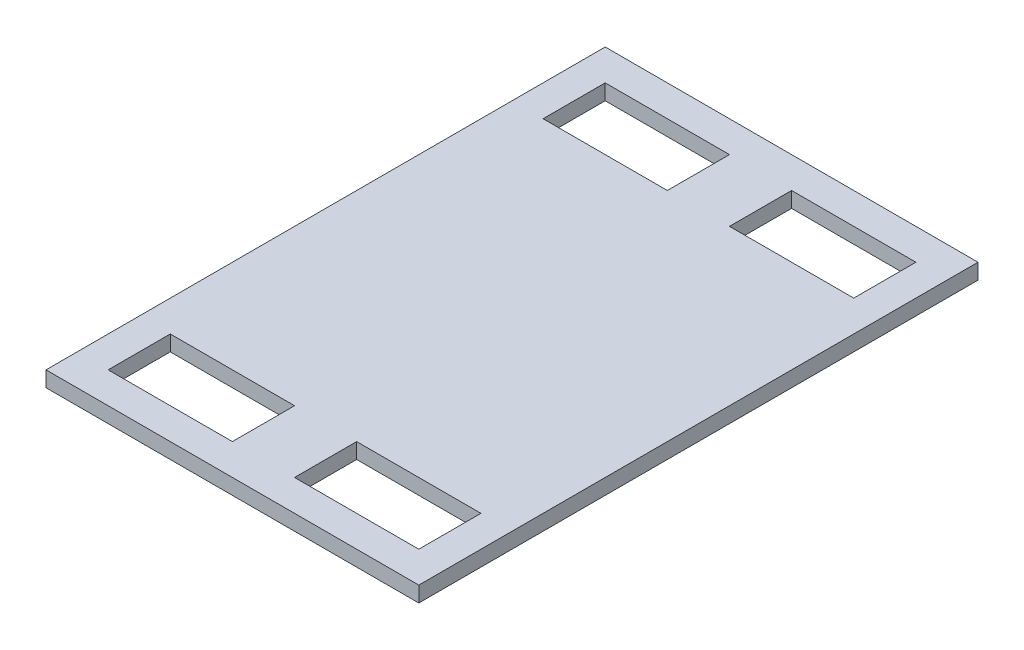
ISO-10303-21;
HEADER;
FILE_DESCRIPTION(('STEP AP214'),'2;1');
FILE_NAME('part.step','',(''),(''),'','','');
FILE_SCHEMA(('AUTOMOTIVE_DESIGN { 1 0 10303 214 1 1 1 1 }'));
ENDSEC;
DATA;
#1=APPLICATION_CONTEXT('core data for automotive mechanical design processes');
#2=APPLICATION_PROTOCOL_DEFINITION('international standard','automotive_design',2000,#1);
#3=PRODUCT_CONTEXT('',#1,'mechanical');
#4=PRODUCT('Part','Part','',(#3));
#5=PRODUCT_RELATED_PRODUCT_CATEGORY('part','',(#4));
#6=PRODUCT_DEFINITION_FORMATION('','',#4);
#7=PRODUCT_DEFINITION_CONTEXT('part definition',#1,'design');
#8=PRODUCT_DEFINITION('design','',#6,#7);
#9=PRODUCT_DEFINITION_SHAPE('','',#8);
#10=(LENGTH_UNIT() NAMED_UNIT(*) SI_UNIT(.MILLI.,.METRE.));
#11=(NAMED_UNIT(*) PLANE_ANGLE_UNIT() SI_UNIT($,.RADIAN.));
#12=(NAMED_UNIT(*) SI_UNIT($,.STERADIAN.) SOLID_ANGLE_UNIT());
#13=UNCERTAINTY_MEASURE_WITH_UNIT(LENGTH_MEASURE(1.E-05),#10,'distance_accuracy_value','');
#14=(GEOMETRIC_REPRESENTATION_CONTEXT(3) GLOBAL_UNCERTAINTY_ASSIGNED_CONTEXT((#13)) GLOBAL_UNIT_ASSIGNED_CONTEXT((#10,
#11,#12)) REPRESENTATION_CONTEXT('',''));
#15=CARTESIAN_POINT('',(0.,0.,0.));
#16=DIRECTION('',(0.,0.,1.));
#17=DIRECTION('',(1.,0.,0.));
#18=AXIS2_PLACEMENT_3D('',#15,#16,#17);
#19=CARTESIAN_POINT('',(0.,5.,0.));
#20=DIRECTION('',(0.,-1.,0.));
#21=DIRECTION('',(0.,0.,-1.));
#22=AXIS2_PLACEMENT_3D('',#19,#20,#21);
#23=PLANE('',#22);
#24=DIRECTION('',(1.,0.,0.));
#25=VECTOR('',#24,1.);
#26=CARTESIAN_POINT('',(50.,5.,-30.));
#27=LINE('',#26,#25);
#28=CARTESIAN_POINT('',(10.,5.,-30.));
#29=VERTEX_POINT('',#28);
#30=CARTESIAN_POINT('',(50.,5.,-30.));
#31=VERTEX_POINT('',#30);
#32=EDGE_CURVE('E436',#29,#31,#27,.T.);
#33=ORIENTED_EDGE('',*,*,#32,.T.);
#34=DIRECTION('',(0.,0.,-1.));
#35=VECTOR('',#34,1.);
#36=CARTESIAN_POINT('',(50.,5.,-30.));
#37=LINE('',#36,#35);
#38=CARTESIAN_POINT('',(50.,5.,-10.));
#39=VERTEX_POINT('',#38);
#40=EDGE_CURVE('E173',#39,#31,#37,.T.);
#41=ORIENTED_EDGE('',*,*,#40,.F.);
#42=DIRECTION('',(1.,0.,0.));
#43=VECTOR('',#42,1.);
#44=CARTESIAN_POINT('',(50.,5.,-10.));
#45=LINE('',#44,#43);
#46=CARTESIAN_POINT('',(10.,5.,-10.));
#47=VERTEX_POINT('',#46);
#48=EDGE_CURVE('E202',#47,#39,#45,.T.);
#49=ORIENTED_EDGE('',*,*,#48,.F.);
#50=DIRECTION('',(0.,0.,-1.));
#51=VECTOR('',#50,1.);
#52=CARTESIAN_POINT('',(10.,5.,-30.));
#53=LINE('',#52,#51);
#54=EDGE_CURVE('E176',#47,#29,#53,.T.);
#55=ORIENTED_EDGE('',*,*,#54,.T.);
#56=EDGE_LOOP('',(#33,#41,#49,#55));
#57=FACE_BOUND('',#56,.T.);
#58=DIRECTION('',(0.,0.,1.));
#59=VECTOR('',#58,1.);
#60=CARTESIAN_POINT('',(50.,5.,-150.));
#61=LINE('',#60,#59);
#62=CARTESIAN_POINT('',(50.,5.,-170.));
#63=VERTEX_POINT('',#62);
#64=CARTESIAN_POINT('',(50.,5.,-150.));
#65=VERTEX_POINT('',#64);
#66=EDGE_CURVE('E274',#63,#65,#61,.T.);
#67=ORIENTED_EDGE('',*,*,#66,.T.);
#68=DIRECTION('',(1.,0.,0.));
#69=VECTOR('',#68,1.);
#70=CARTESIAN_POINT('',(50.,5.,-150.));
#71=LINE('',#70,#69);
#72=CARTESIAN_POINT('',(10.,5.,-150.));
#73=VERTEX_POINT('',#72);
#74=EDGE_CURVE('E277',#73,#65,#71,.T.);
#75=ORIENTED_EDGE('',*,*,#74,.F.);
#76=DIRECTION('',(0.,0.,1.));
#77=VECTOR('',#76,1.);
#78=CARTESIAN_POINT('',(10.,5.,-150.));
#79=LINE('',#78,#77);
#80=CARTESIAN_POINT('',(10.,5.,-170.));
#81=VERTEX_POINT('',#80);
#82=EDGE_CURVE('E267',#81,#73,#79,.T.);
#83=ORIENTED_EDGE('',*,*,#82,.F.);
#84=DIRECTION('',(1.,0.,0.));
#85=VECTOR('',#84,1.);
#86=CARTESIAN_POINT('',(50.,5.,-170.));
#87=LINE('',#86,#85);
#88=EDGE_CURVE('E270',#81,#63,#87,.T.);
#89=ORIENTED_EDGE('',*,*,#88,.T.);
#90=EDGE_LOOP('',(#67,#75,#83,#89));
#91=FACE_BOUND('',#90,.T.);
#92=DIRECTION('',(0.,0.,1.));
#93=VECTOR('',#92,1.);
#94=CARTESIAN_POINT('',(0.,5.,0.));
#95=LINE('',#94,#93);
#96=CARTESIAN_POINT('',(0.,5.,-180.));
#97=VERTEX_POINT('',#96);
#98=CARTESIAN_POINT('',(0.,5.,0.));
#99=VERTEX_POINT('',#98);
#100=EDGE_CURVE('E299',#97,#99,#95,.T.);
#101=ORIENTED_EDGE('',*,*,#100,.T.);
#102=DIRECTION('',(1.,0.,0.));
#103=VECTOR('',#102,1.);
#104=CARTESIAN_POINT('',(0.,5.,0.));
#105=LINE('',#104,#103);
#106=CARTESIAN_POINT('',(120.,5.,0.));
#107=VERTEX_POINT('',#106);
#108=EDGE_CURVE('E302',#99,#107,#105,.T.);
#109=ORIENTED_EDGE('',*,*,#108,.T.);
#110=DIRECTION('',(0.,0.,-1.));
#111=VECTOR('',#110,1.);
#112=CARTESIAN_POINT('',(120.,5.,0.));
#113=LINE('',#112,#111);
#114=CARTESIAN_POINT('',(120.,5.,-180.));
#115=VERTEX_POINT('',#114);
#116=EDGE_CURVE('E305',#107,#115,#113,.T.);
#117=ORIENTED_EDGE('',*,*,#116,.T.);
#118=DIRECTION('',(-1.,0.,0.));
#119=VECTOR('',#118,1.);
#120=CARTESIAN_POINT('',(0.,5.,-180.));
#121=LINE('',#120,#119);
#122=EDGE_CURVE('E307',#115,#97,#121,.T.);
#123=ORIENTED_EDGE('',*,*,#122,.T.);
#124=EDGE_LOOP('',(#101,#109,#117,#123));
#125=FACE_BOUND('',#124,.T.);
#126=DIRECTION('',(-1.,0.,0.));
#127=VECTOR('',#126,1.);
#128=CARTESIAN_POINT('',(70.,5.,-150.));
#129=LINE('',#128,#127);
#130=CARTESIAN_POINT('',(110.,5.,-150.));
#131=VERTEX_POINT('',#130);
#132=CARTESIAN_POINT('',(70.,5.,-150.));
#133=VERTEX_POINT('',#132);
#134=EDGE_CURVE('E240',#131,#133,#129,.T.);
#135=ORIENTED_EDGE('',*,*,#134,.T.);
#136=DIRECTION('',(0.,0.,1.));
#137=VECTOR('',#136,1.);
#138=CARTESIAN_POINT('',(70.,5.,-150.));
#139=LINE('',#138,#137);
#140=CARTESIAN_POINT('',(70.,5.,-170.));
#141=VERTEX_POINT('',#140);
#142=EDGE_CURVE('E244',#141,#133,#139,.T.);
#143=ORIENTED_EDGE('',*,*,#142,.F.);
#144=DIRECTION('',(-1.,0.,0.));
#145=VECTOR('',#144,1.);
#146=CARTESIAN_POINT('',(70.,5.,-170.));
#147=LINE('',#146,#145);
#148=CARTESIAN_POINT('',(110.,5.,-170.));
#149=VERTEX_POINT('',#148);
#150=EDGE_CURVE('E246',#149,#141,#147,.T.);
#151=ORIENTED_EDGE('',*,*,#150,.F.);
#152=DIRECTION('',(0.,0.,1.));
#153=VECTOR('',#152,1.);
#154=CARTESIAN_POINT('',(110.,5.,-150.));
#155=LINE('',#154,#153);
#156=EDGE_CURVE('E237',#149,#131,#155,.T.);
#157=ORIENTED_EDGE('',*,*,#156,.T.);
#158=EDGE_LOOP('',(#135,#143,#151,#157));
#159=FACE_BOUND('',#158,.T.);
#160=DIRECTION('',(0.,0.,-1.));
#161=VECTOR('',#160,1.);
#162=CARTESIAN_POINT('',(70.,5.,-30.));
#163=LINE('',#162,#161);
#164=CARTESIAN_POINT('',(70.,5.,-10.));
#165=VERTEX_POINT('',#164);
#166=CARTESIAN_POINT('',(70.,5.,-30.));
#167=VERTEX_POINT('',#166);
#168=EDGE_CURVE('E212',#165,#167,#163,.T.);
#169=ORIENTED_EDGE('',*,*,#168,.T.);
#170=DIRECTION('',(-1.,0.,0.));
#171=VECTOR('',#170,1.);
#172=CARTESIAN_POINT('',(70.,5.,-30.));
#173=LINE('',#172,#171);
#174=CARTESIAN_POINT('',(110.,5.,-30.));
#175=VERTEX_POINT('',#174);
#176=EDGE_CURVE('E215',#175,#167,#173,.T.);
#177=ORIENTED_EDGE('',*,*,#176,.F.);
#178=DIRECTION('',(0.,0.,-1.));
#179=VECTOR('',#178,1.);
#180=CARTESIAN_POINT('',(110.,5.,-30.));
#181=LINE('',#180,#179);
#182=CARTESIAN_POINT('',(110.,5.,-10.));
#183=VERTEX_POINT('',#182);
#184=EDGE_CURVE('E205',#183,#175,#181,.T.);
#185=ORIENTED_EDGE('',*,*,#184,.F.);
#186=DIRECTION('',(-1.,0.,0.));
#187=VECTOR('',#186,1.);
#188=CARTESIAN_POINT('',(70.,5.,-10.));
#189=LINE('',#188,#187);
#190=EDGE_CURVE('E208',#183,#165,#189,.T.);
#191=ORIENTED_EDGE('',*,*,#190,.T.);
#192=EDGE_LOOP('',(#169,#177,#185,#191));
#193=FACE_BOUND('',#192,.T.);
#194=ADVANCED_FACE('F33',(#57,#91,#125,#159,#193),#23,.F.);
#195=CARTESIAN_POINT('',(0.,0.,0.));
#196=DIRECTION('',(0.,-1.,0.));
#197=DIRECTION('',(0.,0.,-1.));
#198=AXIS2_PLACEMENT_3D('',#195,#196,#197);
#199=PLANE('',#198);
#200=DIRECTION('',(0.,0.,1.));
#201=VECTOR('',#200,1.);
#202=CARTESIAN_POINT('',(50.,0.,-30.));
#203=LINE('',#202,#201);
#204=CARTESIAN_POINT('',(50.,0.,-30.));
#205=VERTEX_POINT('',#204);
#206=CARTESIAN_POINT('',(50.,0.,-10.));
#207=VERTEX_POINT('',#206);
#208=EDGE_CURVE('E56',#205,#207,#203,.T.);
#209=ORIENTED_EDGE('',*,*,#208,.F.);
#210=DIRECTION('',(-1.,0.,0.));
#211=VECTOR('',#210,1.);
#212=CARTESIAN_POINT('',(50.,0.,-30.));
#213=LINE('',#212,#211);
#214=CARTESIAN_POINT('',(10.,0.,-30.));
#215=VERTEX_POINT('',#214);
#216=EDGE_CURVE('E180',#205,#215,#213,.T.);
#217=ORIENTED_EDGE('',*,*,#216,.T.);
#218=DIRECTION('',(0.,0.,1.));
#219=VECTOR('',#218,1.);
#220=CARTESIAN_POINT('',(10.,0.,-30.));
#221=LINE('',#220,#219);
#222=CARTESIAN_POINT('',(10.,0.,-10.));
#223=VERTEX_POINT('',#222);
#224=EDGE_CURVE('E186',#215,#223,#221,.T.);
#225=ORIENTED_EDGE('',*,*,#224,.T.);
#226=DIRECTION('',(-1.,0.,0.));
#227=VECTOR('',#226,1.);
#228=CARTESIAN_POINT('',(50.,0.,-10.));
#229=LINE('',#228,#227);
#230=EDGE_CURVE('E191',#207,#223,#229,.T.);
#231=ORIENTED_EDGE('',*,*,#230,.F.);
#232=EDGE_LOOP('',(#209,#217,#225,#231));
#233=FACE_BOUND('',#232,.T.);
#234=DIRECTION('',(-1.,0.,0.));
#235=VECTOR('',#234,1.);
#236=CARTESIAN_POINT('',(50.,0.,-150.));
#237=LINE('',#236,#235);
#238=CARTESIAN_POINT('',(50.,0.,-150.));
#239=VERTEX_POINT('',#238);
#240=CARTESIAN_POINT('',(10.,0.,-150.));
#241=VERTEX_POINT('',#240);
#242=EDGE_CURVE('E286',#239,#241,#237,.T.);
#243=ORIENTED_EDGE('',*,*,#242,.F.);
#244=DIRECTION('',(0.,0.,-1.));
#245=VECTOR('',#244,1.);
#246=CARTESIAN_POINT('',(50.,0.,-150.));
#247=LINE('',#246,#245);
#248=CARTESIAN_POINT('',(50.,0.,-170.));
#249=VERTEX_POINT('',#248);
#250=EDGE_CURVE('E266',#239,#249,#247,.T.);
#251=ORIENTED_EDGE('',*,*,#250,.T.);
#252=DIRECTION('',(-1.,0.,0.));
#253=VECTOR('',#252,1.);
#254=CARTESIAN_POINT('',(50.,0.,-170.));
#255=LINE('',#254,#253);
#256=CARTESIAN_POINT('',(10.,0.,-170.));
#257=VERTEX_POINT('',#256);
#258=EDGE_CURVE('E280',#249,#257,#255,.T.);
#259=ORIENTED_EDGE('',*,*,#258,.T.);
#260=DIRECTION('',(0.,0.,-1.));
#261=VECTOR('',#260,1.);
#262=CARTESIAN_POINT('',(10.,0.,-150.));
#263=LINE('',#262,#261);
#264=EDGE_CURVE('E283',#241,#257,#263,.T.);
#265=ORIENTED_EDGE('',*,*,#264,.F.);
#266=EDGE_LOOP('',(#243,#251,#259,#265));
#267=FACE_BOUND('',#266,.T.);
#268=DIRECTION('',(0.,0.,1.));
#269=VECTOR('',#268,1.);
#270=CARTESIAN_POINT('',(0.,0.,0.));
#271=LINE('',#270,#269);
#272=CARTESIAN_POINT('',(0.,0.,-180.));
#273=VERTEX_POINT('',#272);
#274=CARTESIAN_POINT('',(0.,0.,0.));
#275=VERTEX_POINT('',#274);
#276=EDGE_CURVE('E298',#273,#275,#271,.T.);
#277=ORIENTED_EDGE('',*,*,#276,.F.);
#278=DIRECTION('',(-1.,0.,0.));
#279=VECTOR('',#278,1.);
#280=CARTESIAN_POINT('',(0.,0.,-180.));
#281=LINE('',#280,#279);
#282=CARTESIAN_POINT('',(120.,0.,-180.));
#283=VERTEX_POINT('',#282);
#284=EDGE_CURVE('E303',#283,#273,#281,.T.);
#285=ORIENTED_EDGE('',*,*,#284,.F.);
#286=DIRECTION('',(0.,0.,-1.));
#287=VECTOR('',#286,1.);
#288=CARTESIAN_POINT('',(120.,0.,0.));
#289=LINE('',#288,#287);
#290=CARTESIAN_POINT('',(120.,0.,0.));
#291=VERTEX_POINT('',#290);
#292=EDGE_CURVE('E314',#291,#283,#289,.T.);
#293=ORIENTED_EDGE('',*,*,#292,.F.);
#294=DIRECTION('',(1.,0.,0.));
#295=VECTOR('',#294,1.);
#296=CARTESIAN_POINT('',(0.,0.,0.));
#297=LINE('',#296,#295);
#298=EDGE_CURVE('E312',#275,#291,#297,.T.);
#299=ORIENTED_EDGE('',*,*,#298,.F.);
#300=EDGE_LOOP('',(#277,#285,#293,#299));
#301=FACE_BOUND('',#300,.T.);
#302=DIRECTION('',(0.,0.,-1.));
#303=VECTOR('',#302,1.);
#304=CARTESIAN_POINT('',(70.,0.,-150.));
#305=LINE('',#304,#303);
#306=CARTESIAN_POINT('',(70.,0.,-150.));
#307=VERTEX_POINT('',#306);
#308=CARTESIAN_POINT('',(70.,0.,-170.));
#309=VERTEX_POINT('',#308);
#310=EDGE_CURVE('E236',#307,#309,#305,.T.);
#311=ORIENTED_EDGE('',*,*,#310,.F.);
#312=DIRECTION('',(1.,0.,0.));
#313=VECTOR('',#312,1.);
#314=CARTESIAN_POINT('',(70.,0.,-150.));
#315=LINE('',#314,#313);
#316=CARTESIAN_POINT('',(110.,0.,-150.));
#317=VERTEX_POINT('',#316);
#318=EDGE_CURVE('E248',#307,#317,#315,.T.);
#319=ORIENTED_EDGE('',*,*,#318,.T.);
#320=DIRECTION('',(0.,0.,-1.));
#321=VECTOR('',#320,1.);
#322=CARTESIAN_POINT('',(110.,0.,-150.));
#323=LINE('',#322,#321);
#324=CARTESIAN_POINT('',(110.,0.,-170.));
#325=VERTEX_POINT('',#324);
#326=EDGE_CURVE('E251',#317,#325,#323,.T.);
#327=ORIENTED_EDGE('',*,*,#326,.T.);
#328=DIRECTION('',(1.,0.,0.));
#329=VECTOR('',#328,1.);
#330=CARTESIAN_POINT('',(70.,0.,-170.));
#331=LINE('',#330,#329);
#332=EDGE_CURVE('E254',#309,#325,#331,.T.);
#333=ORIENTED_EDGE('',*,*,#332,.F.);
#334=EDGE_LOOP('',(#311,#319,#327,#333));
#335=FACE_BOUND('',#334,.T.);
#336=DIRECTION('',(1.,0.,0.));
#337=VECTOR('',#336,1.);
#338=CARTESIAN_POINT('',(70.,0.,-30.));
#339=LINE('',#338,#337);
#340=CARTESIAN_POINT('',(70.,0.,-30.));
#341=VERTEX_POINT('',#340);
#342=CARTESIAN_POINT('',(110.,0.,-30.));
#343=VERTEX_POINT('',#342);
#344=EDGE_CURVE('E224',#341,#343,#339,.T.);
#345=ORIENTED_EDGE('',*,*,#344,.F.);
#346=DIRECTION('',(0.,0.,1.));
#347=VECTOR('',#346,1.);
#348=CARTESIAN_POINT('',(70.,0.,-30.));
#349=LINE('',#348,#347);
#350=CARTESIAN_POINT('',(70.,0.,-10.));
#351=VERTEX_POINT('',#350);
#352=EDGE_CURVE('E204',#341,#351,#349,.T.);
#353=ORIENTED_EDGE('',*,*,#352,.T.);
#354=DIRECTION('',(1.,0.,0.));
#355=VECTOR('',#354,1.);
#356=CARTESIAN_POINT('',(70.,0.,-10.));
#357=LINE('',#356,#355);
#358=CARTESIAN_POINT('',(110.,0.,-10.));
#359=VERTEX_POINT('',#358);
#360=EDGE_CURVE('E218',#351,#359,#357,.T.);
#361=ORIENTED_EDGE('',*,*,#360,.T.);
#362=DIRECTION('',(0.,0.,1.));
#363=VECTOR('',#362,1.);
#364=CARTESIAN_POINT('',(110.,0.,-30.));
#365=LINE('',#364,#363);
#366=EDGE_CURVE('E221',#343,#359,#365,.T.);
#367=ORIENTED_EDGE('',*,*,#366,.F.);
#368=EDGE_LOOP('',(#345,#353,#361,#367));
#369=FACE_BOUND('',#368,.T.);
#370=ADVANCED_FACE('F189',(#233,#267,#301,#335,#369),#199,.T.);
#371=CARTESIAN_POINT('',(0.,5.,0.));
#372=DIRECTION('',(1.,0.,0.));
#373=DIRECTION('',(0.,0.,-1.));
#374=AXIS2_PLACEMENT_3D('',#371,#372,#373);
#375=PLANE('',#374);
#376=ORIENTED_EDGE('',*,*,#276,.T.);
#377=DIRECTION('',(0.,-1.,0.));
#378=VECTOR('',#377,1.);
#379=CARTESIAN_POINT('',(0.,5.,0.));
#380=LINE('',#379,#378);
#381=EDGE_CURVE('E11',#99,#275,#380,.T.);
#382=ORIENTED_EDGE('',*,*,#381,.F.);
#383=ORIENTED_EDGE('',*,*,#100,.F.);
#384=DIRECTION('',(0.,-1.,0.));
#385=VECTOR('',#384,1.);
#386=CARTESIAN_POINT('',(0.,5.,-180.));
#387=LINE('',#386,#385);
#388=EDGE_CURVE('E309',#97,#273,#387,.T.);
#389=ORIENTED_EDGE('',*,*,#388,.T.);
#390=EDGE_LOOP('',(#376,#382,#383,#389));
#391=FACE_BOUND('',#390,.T.);
#392=ADVANCED_FACE('F35',(#391),#375,.F.);
#393=CARTESIAN_POINT('',(0.,5.,0.));
#394=DIRECTION('',(0.,0.,-1.));
#395=DIRECTION('',(-1.,0.,0.));
#396=AXIS2_PLACEMENT_3D('',#393,#394,#395);
#397=PLANE('',#396);
#398=ORIENTED_EDGE('',*,*,#298,.T.);
#399=DIRECTION('',(0.,-1.,0.));
#400=VECTOR('',#399,1.);
#401=CARTESIAN_POINT('',(120.,5.,0.));
#402=LINE('',#401,#400);
#403=EDGE_CURVE('E41',#107,#291,#402,.T.);
#404=ORIENTED_EDGE('',*,*,#403,.F.);
#405=ORIENTED_EDGE('',*,*,#108,.F.);
#406=ORIENTED_EDGE('',*,*,#381,.T.);
#407=EDGE_LOOP('',(#398,#404,#405,#406));
#408=FACE_BOUND('',#407,.T.);
#409=ADVANCED_FACE('F342',(#408),#397,.F.);
#410=CARTESIAN_POINT('',(120.,5.,0.));
#411=DIRECTION('',(-1.,0.,0.));
#412=DIRECTION('',(0.,0.,1.));
#413=AXIS2_PLACEMENT_3D('',#410,#411,#412);
#414=PLANE('',#413);
#415=ORIENTED_EDGE('',*,*,#292,.T.);
#416=DIRECTION('',(0.,-1.,0.));
#417=VECTOR('',#416,1.);
#418=CARTESIAN_POINT('',(120.,5.,-180.));
#419=LINE('',#418,#417);
#420=EDGE_CURVE('E319',#115,#283,#419,.T.);
#421=ORIENTED_EDGE('',*,*,#420,.F.);
#422=ORIENTED_EDGE('',*,*,#116,.F.);
#423=ORIENTED_EDGE('',*,*,#403,.T.);
#424=EDGE_LOOP('',(#415,#421,#422,#423));
#425=FACE_BOUND('',#424,.T.);
#426=ADVANCED_FACE('F326',(#425),#414,.F.);
#427=CARTESIAN_POINT('',(0.,5.,-180.));
#428=DIRECTION('',(0.,0.,1.));
#429=DIRECTION('',(1.,0.,0.));
#430=AXIS2_PLACEMENT_3D('',#427,#428,#429);
#431=PLANE('',#430);
#432=ORIENTED_EDGE('',*,*,#284,.T.);
#433=ORIENTED_EDGE('',*,*,#388,.F.);
#434=ORIENTED_EDGE('',*,*,#122,.F.);
#435=ORIENTED_EDGE('',*,*,#420,.T.);
#436=EDGE_LOOP('',(#432,#433,#434,#435));
#437=FACE_BOUND('',#436,.T.);
#438=ADVANCED_FACE('F335',(#437),#431,.F.);
#439=CARTESIAN_POINT('',(50.,49.7213595499958,-150.));
#440=DIRECTION('',(-1.,0.,0.));
#441=DIRECTION('',(0.,0.,1.));
#442=AXIS2_PLACEMENT_3D('',#439,#440,#441);
#443=PLANE('',#442);
#444=DIRECTION('',(0.,-1.,0.));
#445=VECTOR('',#444,1.);
#446=CARTESIAN_POINT('',(50.,49.7213595499958,-170.));
#447=LINE('',#446,#445);
#448=EDGE_CURVE('E271',#63,#249,#447,.T.);
#449=ORIENTED_EDGE('',*,*,#448,.T.);
#450=ORIENTED_EDGE('',*,*,#250,.F.);
#451=DIRECTION('',(0.,-1.,0.));
#452=VECTOR('',#451,1.);
#453=CARTESIAN_POINT('',(50.,49.7213595499958,-150.));
#454=LINE('',#453,#452);
#455=EDGE_CURVE('E289',#65,#239,#454,.T.);
#456=ORIENTED_EDGE('',*,*,#455,.F.);
#457=ORIENTED_EDGE('',*,*,#66,.F.);
#458=EDGE_LOOP('',(#449,#450,#456,#457));
#459=FACE_BOUND('',#458,.T.);
#460=ADVANCED_FACE('F358',(#459),#443,.T.);
#461=CARTESIAN_POINT('',(50.,49.7213595499958,-170.));
#462=DIRECTION('',(0.,0.,1.));
#463=DIRECTION('',(1.,0.,0.));
#464=AXIS2_PLACEMENT_3D('',#461,#462,#463);
#465=PLANE('',#464);
#466=DIRECTION('',(0.,-1.,0.));
#467=VECTOR('',#466,1.);
#468=CARTESIAN_POINT('',(10.,49.7213595499958,-170.));
#469=LINE('',#468,#467);
#470=EDGE_CURVE('E294',#81,#257,#469,.T.);
#471=ORIENTED_EDGE('',*,*,#470,.T.);
#472=ORIENTED_EDGE('',*,*,#258,.F.);
#473=ORIENTED_EDGE('',*,*,#448,.F.);
#474=ORIENTED_EDGE('',*,*,#88,.F.);
#475=EDGE_LOOP('',(#471,#472,#473,#474));
#476=FACE_BOUND('',#475,.T.);
#477=ADVANCED_FACE('F365',(#476),#465,.T.);
#478=CARTESIAN_POINT('',(10.,49.7213595499958,-150.));
#479=DIRECTION('',(-1.,0.,0.));
#480=DIRECTION('',(0.,0.,1.));
#481=AXIS2_PLACEMENT_3D('',#478,#479,#480);
#482=PLANE('',#481);
#483=ORIENTED_EDGE('',*,*,#82,.T.);
#484=DIRECTION('',(0.,-1.,0.));
#485=VECTOR('',#484,1.);
#486=CARTESIAN_POINT('',(10.,49.7213595499958,-150.));
#487=LINE('',#486,#485);
#488=EDGE_CURVE('E292',#73,#241,#487,.T.);
#489=ORIENTED_EDGE('',*,*,#488,.T.);
#490=ORIENTED_EDGE('',*,*,#264,.T.);
#491=ORIENTED_EDGE('',*,*,#470,.F.);
#492=EDGE_LOOP('',(#483,#489,#490,#491));
#493=FACE_BOUND('',#492,.T.);
#494=ADVANCED_FACE('F370',(#493),#482,.F.);
#495=CARTESIAN_POINT('',(50.,49.7213595499958,-150.));
#496=DIRECTION('',(0.,0.,1.));
#497=DIRECTION('',(1.,0.,0.));
#498=AXIS2_PLACEMENT_3D('',#495,#496,#497);
#499=PLANE('',#498);
#500=ORIENTED_EDGE('',*,*,#74,.T.);
#501=ORIENTED_EDGE('',*,*,#455,.T.);
#502=ORIENTED_EDGE('',*,*,#242,.T.);
#503=ORIENTED_EDGE('',*,*,#488,.F.);
#504=EDGE_LOOP('',(#500,#501,#502,#503));
#505=FACE_BOUND('',#504,.T.);
#506=ADVANCED_FACE('F379',(#505),#499,.F.);
#507=CARTESIAN_POINT('',(70.,49.7213595499958,-150.));
#508=DIRECTION('',(-1.,0.,0.));
#509=DIRECTION('',(0.,0.,1.));
#510=AXIS2_PLACEMENT_3D('',#507,#508,#509);
#511=PLANE('',#510);
#512=ORIENTED_EDGE('',*,*,#142,.T.);
#513=DIRECTION('',(0.,-1.,0.));
#514=VECTOR('',#513,1.);
#515=CARTESIAN_POINT('',(70.,49.7213595499958,-150.));
#516=LINE('',#515,#514);
#517=EDGE_CURVE('E241',#133,#307,#516,.T.);
#518=ORIENTED_EDGE('',*,*,#517,.T.);
#519=ORIENTED_EDGE('',*,*,#310,.T.);
#520=DIRECTION('',(0.,-1.,0.));
#521=VECTOR('',#520,1.);
#522=CARTESIAN_POINT('',(70.,49.7213595499958,-170.));
#523=LINE('',#522,#521);
#524=EDGE_CURVE('E257',#141,#309,#523,.T.);
#525=ORIENTED_EDGE('',*,*,#524,.F.);
#526=EDGE_LOOP('',(#512,#518,#519,#525));
#527=FACE_BOUND('',#526,.T.);
#528=ADVANCED_FACE('F388',(#527),#511,.F.);
#529=CARTESIAN_POINT('',(70.,49.7213595499958,-150.));
#530=DIRECTION('',(0.,0.,-1.));
#531=DIRECTION('',(-1.,0.,0.));
#532=AXIS2_PLACEMENT_3D('',#529,#530,#531);
#533=PLANE('',#532);
#534=DIRECTION('',(0.,-1.,0.));
#535=VECTOR('',#534,1.);
#536=CARTESIAN_POINT('',(110.,49.7213595499958,-150.));
#537=LINE('',#536,#535);
#538=EDGE_CURVE('E262',#131,#317,#537,.T.);
#539=ORIENTED_EDGE('',*,*,#538,.T.);
#540=ORIENTED_EDGE('',*,*,#318,.F.);
#541=ORIENTED_EDGE('',*,*,#517,.F.);
#542=ORIENTED_EDGE('',*,*,#134,.F.);
#543=EDGE_LOOP('',(#539,#540,#541,#542));
#544=FACE_BOUND('',#543,.T.);
#545=ADVANCED_FACE('F393',(#544),#533,.T.);
#546=CARTESIAN_POINT('',(110.,49.7213595499958,-150.));
#547=DIRECTION('',(-1.,0.,0.));
#548=DIRECTION('',(0.,0.,1.));
#549=AXIS2_PLACEMENT_3D('',#546,#547,#548);
#550=PLANE('',#549);
#551=DIRECTION('',(0.,-1.,0.));
#552=VECTOR('',#551,1.);
#553=CARTESIAN_POINT('',(110.,49.7213595499958,-170.));
#554=LINE('',#553,#552);
#555=EDGE_CURVE('E260',#149,#325,#554,.T.);
#556=ORIENTED_EDGE('',*,*,#555,.T.);
#557=ORIENTED_EDGE('',*,*,#326,.F.);
#558=ORIENTED_EDGE('',*,*,#538,.F.);
#559=ORIENTED_EDGE('',*,*,#156,.F.);
#560=EDGE_LOOP('',(#556,#557,#558,#559));
#561=FACE_BOUND('',#560,.T.);
#562=ADVANCED_FACE('F397',(#561),#550,.T.);
#563=CARTESIAN_POINT('',(70.,49.7213595499958,-170.));
#564=DIRECTION('',(0.,0.,-1.));
#565=DIRECTION('',(-1.,0.,0.));
#566=AXIS2_PLACEMENT_3D('',#563,#564,#565);
#567=PLANE('',#566);
#568=ORIENTED_EDGE('',*,*,#150,.T.);
#569=ORIENTED_EDGE('',*,*,#524,.T.);
#570=ORIENTED_EDGE('',*,*,#332,.T.);
#571=ORIENTED_EDGE('',*,*,#555,.F.);
#572=EDGE_LOOP('',(#568,#569,#570,#571));
#573=FACE_BOUND('',#572,.T.);
#574=ADVANCED_FACE('F401',(#573),#567,.F.);
#575=CARTESIAN_POINT('',(70.,49.7213595499958,-30.));
#576=DIRECTION('',(1.,0.,0.));
#577=DIRECTION('',(0.,0.,-1.));
#578=AXIS2_PLACEMENT_3D('',#575,#576,#577);
#579=PLANE('',#578);
#580=DIRECTION('',(0.,-1.,0.));
#581=VECTOR('',#580,1.);
#582=CARTESIAN_POINT('',(70.,49.7213595499958,-10.));
#583=LINE('',#582,#581);
#584=EDGE_CURVE('E209',#165,#351,#583,.T.);
#585=ORIENTED_EDGE('',*,*,#584,.T.);
#586=ORIENTED_EDGE('',*,*,#352,.F.);
#587=DIRECTION('',(0.,-1.,0.));
#588=VECTOR('',#587,1.);
#589=CARTESIAN_POINT('',(70.,49.7213595499958,-30.));
#590=LINE('',#589,#588);
#591=EDGE_CURVE('E227',#167,#341,#590,.T.);
#592=ORIENTED_EDGE('',*,*,#591,.F.);
#593=ORIENTED_EDGE('',*,*,#168,.F.);
#594=EDGE_LOOP('',(#585,#586,#592,#593));
#595=FACE_BOUND('',#594,.T.);
#596=ADVANCED_FACE('F405',(#595),#579,.T.);
#597=CARTESIAN_POINT('',(70.,49.7213595499958,-10.));
#598=DIRECTION('',(0.,0.,-1.));
#599=DIRECTION('',(-1.,0.,0.));
#600=AXIS2_PLACEMENT_3D('',#597,#598,#599);
#601=PLANE('',#600);
#602=DIRECTION('',(0.,-1.,0.));
#603=VECTOR('',#602,1.);
#604=CARTESIAN_POINT('',(110.,49.7213595499958,-10.));
#605=LINE('',#604,#603);
#606=EDGE_CURVE('E232',#183,#359,#605,.T.);
#607=ORIENTED_EDGE('',*,*,#606,.T.);
#608=ORIENTED_EDGE('',*,*,#360,.F.);
#609=ORIENTED_EDGE('',*,*,#584,.F.);
#610=ORIENTED_EDGE('',*,*,#190,.F.);
#611=EDGE_LOOP('',(#607,#608,#609,#610));
#612=FACE_BOUND('',#611,.T.);
#613=ADVANCED_FACE('F409',(#612),#601,.T.);
#614=CARTESIAN_POINT('',(110.,49.7213595499958,-30.));
#615=DIRECTION('',(1.,0.,0.));
#616=DIRECTION('',(0.,0.,-1.));
#617=AXIS2_PLACEMENT_3D('',#614,#615,#616);
#618=PLANE('',#617);
#619=ORIENTED_EDGE('',*,*,#184,.T.);
#620=DIRECTION('',(0.,-1.,0.));
#621=VECTOR('',#620,1.);
#622=CARTESIAN_POINT('',(110.,49.7213595499958,-30.));
#623=LINE('',#622,#621);
#624=EDGE_CURVE('E230',#175,#343,#623,.T.);
#625=ORIENTED_EDGE('',*,*,#624,.T.);
#626=ORIENTED_EDGE('',*,*,#366,.T.);
#627=ORIENTED_EDGE('',*,*,#606,.F.);
#628=EDGE_LOOP('',(#619,#625,#626,#627));
#629=FACE_BOUND('',#628,.T.);
#630=ADVANCED_FACE('F413',(#629),#618,.F.);
#631=CARTESIAN_POINT('',(70.,49.7213595499958,-30.));
#632=DIRECTION('',(0.,0.,-1.));
#633=DIRECTION('',(-1.,0.,0.));
#634=AXIS2_PLACEMENT_3D('',#631,#632,#633);
#635=PLANE('',#634);
#636=ORIENTED_EDGE('',*,*,#176,.T.);
#637=ORIENTED_EDGE('',*,*,#591,.T.);
#638=ORIENTED_EDGE('',*,*,#344,.T.);
#639=ORIENTED_EDGE('',*,*,#624,.F.);
#640=EDGE_LOOP('',(#636,#637,#638,#639));
#641=FACE_BOUND('',#640,.T.);
#642=ADVANCED_FACE('F417',(#641),#635,.F.);
#643=CARTESIAN_POINT('',(50.,49.7213595499958,-30.));
#644=DIRECTION('',(1.,0.,0.));
#645=DIRECTION('',(0.,0.,-1.));
#646=AXIS2_PLACEMENT_3D('',#643,#644,#645);
#647=PLANE('',#646);
#648=ORIENTED_EDGE('',*,*,#40,.T.);
#649=DIRECTION('',(0.,-1.,0.));
#650=VECTOR('',#649,1.);
#651=CARTESIAN_POINT('',(50.,49.7213595499958,-30.));
#652=LINE('',#651,#650);
#653=EDGE_CURVE('E169',#31,#205,#652,.T.);
#654=ORIENTED_EDGE('',*,*,#653,.T.);
#655=ORIENTED_EDGE('',*,*,#208,.T.);
#656=DIRECTION('',(0.,-1.,0.));
#657=VECTOR('',#656,1.);
#658=CARTESIAN_POINT('',(50.,49.7213595499958,-10.));
#659=LINE('',#658,#657);
#660=EDGE_CURVE('E198',#39,#207,#659,.T.);
#661=ORIENTED_EDGE('',*,*,#660,.F.);
#662=EDGE_LOOP('',(#648,#654,#655,#661));
#663=FACE_BOUND('',#662,.T.);
#664=ADVANCED_FACE('F171',(#663),#647,.F.);
#665=CARTESIAN_POINT('',(50.,49.7213595499958,-30.));
#666=DIRECTION('',(0.,0.,1.));
#667=DIRECTION('',(1.,0.,0.));
#668=AXIS2_PLACEMENT_3D('',#665,#666,#667);
#669=PLANE('',#668);
#670=DIRECTION('',(0.,-1.,0.));
#671=VECTOR('',#670,1.);
#672=CARTESIAN_POINT('',(10.,49.7213595499958,-30.));
#673=LINE('',#672,#671);
#674=EDGE_CURVE('E177',#29,#215,#673,.T.);
#675=ORIENTED_EDGE('',*,*,#674,.T.);
#676=ORIENTED_EDGE('',*,*,#216,.F.);
#677=ORIENTED_EDGE('',*,*,#653,.F.);
#678=ORIENTED_EDGE('',*,*,#32,.F.);
#679=EDGE_LOOP('',(#675,#676,#677,#678));
#680=FACE_BOUND('',#679,.T.);
#681=ADVANCED_FACE('F181',(#680),#669,.T.);
#682=CARTESIAN_POINT('',(10.,49.7213595499958,-30.));
#683=DIRECTION('',(1.,0.,0.));
#684=DIRECTION('',(0.,0.,-1.));
#685=AXIS2_PLACEMENT_3D('',#682,#683,#684);
#686=PLANE('',#685);
#687=DIRECTION('',(0.,-1.,0.));
#688=VECTOR('',#687,1.);
#689=CARTESIAN_POINT('',(10.,49.7213595499958,-10.));
#690=LINE('',#689,#688);
#691=EDGE_CURVE('E48',#47,#223,#690,.T.);
#692=ORIENTED_EDGE('',*,*,#691,.T.);
#693=ORIENTED_EDGE('',*,*,#224,.F.);
#694=ORIENTED_EDGE('',*,*,#674,.F.);
#695=ORIENTED_EDGE('',*,*,#54,.F.);
#696=EDGE_LOOP('',(#692,#693,#694,#695));
#697=FACE_BOUND('',#696,.T.);
#698=ADVANCED_FACE('F426',(#697),#686,.T.);
#699=CARTESIAN_POINT('',(50.,49.7213595499958,-10.));
#700=DIRECTION('',(0.,0.,1.));
#701=DIRECTION('',(1.,0.,0.));
#702=AXIS2_PLACEMENT_3D('',#699,#700,#701);
#703=PLANE('',#702);
#704=ORIENTED_EDGE('',*,*,#48,.T.);
#705=ORIENTED_EDGE('',*,*,#660,.T.);
#706=ORIENTED_EDGE('',*,*,#230,.T.);
#707=ORIENTED_EDGE('',*,*,#691,.F.);
#708=EDGE_LOOP('',(#704,#705,#706,#707));
#709=FACE_BOUND('',#708,.T.);
#710=ADVANCED_FACE('F429',(#709),#703,.F.);
#711=CLOSED_SHELL('',(#194,#370,#392,#409,#426,#438,#460,#477,#494,#506,#528,#545,#562,#574,
#596,#613,#630,#642,#664,#681,#698,#710));
#712=MANIFOLD_SOLID_BREP('B2',#711);
#713=ADVANCED_BREP_SHAPE_REPRESENTATION('',(#18,#712),#14);
#714=SHAPE_DEFINITION_REPRESENTATION(#9,#713);
ENDSEC;
END-ISO-10303-21;
